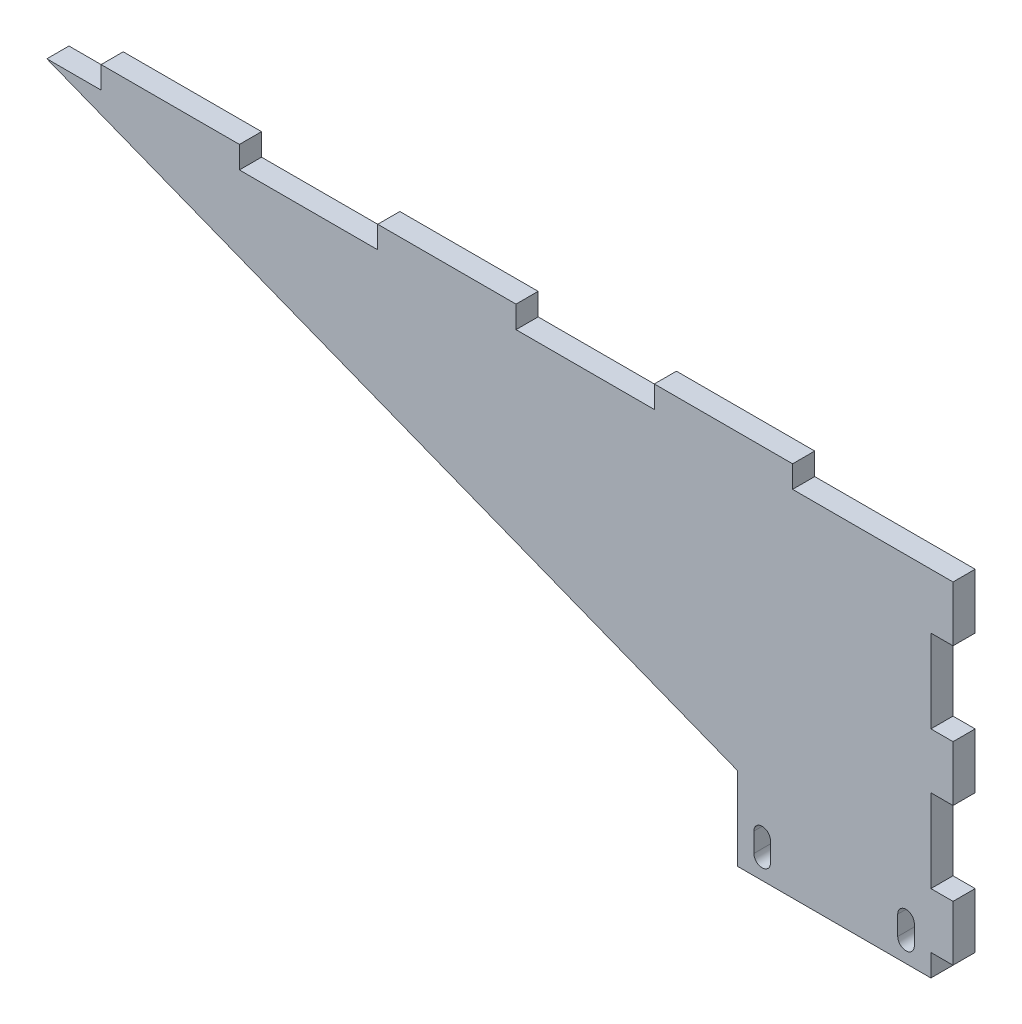
ISO-10303-21;
HEADER;
FILE_DESCRIPTION(('STEP AP214'),'2;1');
FILE_NAME('part.step','',(''),(''),'','','');
FILE_SCHEMA(('AUTOMOTIVE_DESIGN { 1 0 10303 214 1 1 1 1 }'));
ENDSEC;
DATA;
#1=APPLICATION_CONTEXT('core data for automotive mechanical design processes');
#2=APPLICATION_PROTOCOL_DEFINITION('international standard','automotive_design',2000,#1);
#3=PRODUCT_CONTEXT('',#1,'mechanical');
#4=PRODUCT('Part','Part','',(#3));
#5=PRODUCT_RELATED_PRODUCT_CATEGORY('part','',(#4));
#6=PRODUCT_DEFINITION_FORMATION('','',#4);
#7=PRODUCT_DEFINITION_CONTEXT('part definition',#1,'design');
#8=PRODUCT_DEFINITION('design','',#6,#7);
#9=PRODUCT_DEFINITION_SHAPE('','',#8);
#10=(LENGTH_UNIT() NAMED_UNIT(*) SI_UNIT(.MILLI.,.METRE.));
#11=(NAMED_UNIT(*) PLANE_ANGLE_UNIT() SI_UNIT($,.RADIAN.));
#12=(NAMED_UNIT(*) SI_UNIT($,.STERADIAN.) SOLID_ANGLE_UNIT());
#13=UNCERTAINTY_MEASURE_WITH_UNIT(LENGTH_MEASURE(1.E-05),#10,'distance_accuracy_value','');
#14=(GEOMETRIC_REPRESENTATION_CONTEXT(3) GLOBAL_UNCERTAINTY_ASSIGNED_CONTEXT((#13)) GLOBAL_UNIT_ASSIGNED_CONTEXT((#10,
#11,#12)) REPRESENTATION_CONTEXT('',''));
#15=CARTESIAN_POINT('',(0.,0.,0.));
#16=DIRECTION('',(0.,0.,1.));
#17=DIRECTION('',(1.,0.,0.));
#18=AXIS2_PLACEMENT_3D('',#15,#16,#17);
#19=CARTESIAN_POINT('',(0.,4.,2.));
#20=DIRECTION('',(-1.,0.,0.));
#21=DIRECTION('',(0.,0.,1.));
#22=AXIS2_PLACEMENT_3D('',#19,#20,#21);
#23=PLANE('',#22);
#24=DIRECTION('',(0.,0.,1.));
#25=VECTOR('',#24,1.);
#26=CARTESIAN_POINT('',(0.,18.,-2.00000000000052));
#27=LINE('',#26,#25);
#28=CARTESIAN_POINT('',(0.,18.,-2.00000000000052));
#29=VERTEX_POINT('',#28);
#30=CARTESIAN_POINT('',(0.,18.,2.));
#31=VERTEX_POINT('',#30);
#32=EDGE_CURVE('E281',#29,#31,#27,.T.);
#33=ORIENTED_EDGE('',*,*,#32,.F.);
#34=DIRECTION('',(0.,1.,0.));
#35=VECTOR('',#34,1.);
#36=CARTESIAN_POINT('',(0.,4.,-2.));
#37=LINE('',#36,#35);
#38=CARTESIAN_POINT('',(0.,33.,-2.));
#39=VERTEX_POINT('',#38);
#40=EDGE_CURVE('E266',#29,#39,#37,.T.);
#41=ORIENTED_EDGE('',*,*,#40,.T.);
#42=DIRECTION('',(0.,0.,-1.));
#43=VECTOR('',#42,1.);
#44=CARTESIAN_POINT('',(0.,33.,-2.00000000000026));
#45=LINE('',#44,#43);
#46=CARTESIAN_POINT('',(0.,33.,2.));
#47=VERTEX_POINT('',#46);
#48=EDGE_CURVE('E314',#47,#39,#45,.T.);
#49=ORIENTED_EDGE('',*,*,#48,.F.);
#50=DIRECTION('',(0.,1.,0.));
#51=VECTOR('',#50,1.);
#52=CARTESIAN_POINT('',(0.,4.,2.));
#53=LINE('',#52,#51);
#54=EDGE_CURVE('E53',#31,#47,#53,.T.);
#55=ORIENTED_EDGE('',*,*,#54,.F.);
#56=EDGE_LOOP('',(#33,#41,#49,#55));
#57=FACE_BOUND('',#56,.T.);
#58=ADVANCED_FACE('F38',(#57),#23,.F.);
#59=DIRECTION('',(0.,0.,-1.));
#60=VECTOR('',#59,1.);
#61=CARTESIAN_POINT('',(0.,8.00000000000001,-2.00000000000052));
#62=LINE('',#61,#60);
#63=CARTESIAN_POINT('',(0.,8.00000000000001,2.));
#64=VERTEX_POINT('',#63);
#65=CARTESIAN_POINT('',(0.,8.00000000000001,-2.));
#66=VERTEX_POINT('',#65);
#67=EDGE_CURVE('E61',#64,#66,#62,.T.);
#68=ORIENTED_EDGE('',*,*,#67,.F.);
#69=CARTESIAN_POINT('',(0.,4.,2.));
#70=VERTEX_POINT('',#69);
#71=EDGE_CURVE('E495',#70,#64,#53,.T.);
#72=ORIENTED_EDGE('',*,*,#71,.F.);
#73=DIRECTION('',(0.,0.,-1.));
#74=VECTOR('',#73,1.);
#75=CARTESIAN_POINT('',(0.,4.,2.));
#76=LINE('',#75,#74);
#77=CARTESIAN_POINT('',(0.,4.,-2.));
#78=VERTEX_POINT('',#77);
#79=EDGE_CURVE('E46',#70,#78,#76,.T.);
#80=ORIENTED_EDGE('',*,*,#79,.T.);
#81=EDGE_CURVE('E277',#78,#66,#37,.T.);
#82=ORIENTED_EDGE('',*,*,#81,.T.);
#83=EDGE_LOOP('',(#68,#72,#80,#82));
#84=FACE_BOUND('',#83,.T.);
#85=ADVANCED_FACE('F523',(#84),#23,.F.);
#86=DIRECTION('',(0.,0.,1.));
#87=VECTOR('',#86,1.);
#88=CARTESIAN_POINT('',(0.,43.,-2.00000000000026));
#89=LINE('',#88,#87);
#90=CARTESIAN_POINT('',(0.,43.,-2.00000000000026));
#91=VERTEX_POINT('',#90);
#92=CARTESIAN_POINT('',(0.,43.,2.));
#93=VERTEX_POINT('',#92);
#94=EDGE_CURVE('E316',#91,#93,#89,.T.);
#95=ORIENTED_EDGE('',*,*,#94,.F.);
#96=CARTESIAN_POINT('',(0.,58.,-2.));
#97=VERTEX_POINT('',#96);
#98=EDGE_CURVE('E278',#91,#97,#37,.T.);
#99=ORIENTED_EDGE('',*,*,#98,.T.);
#100=DIRECTION('',(0.,0.,-1.));
#101=VECTOR('',#100,1.);
#102=CARTESIAN_POINT('',(0.,58.,-2.));
#103=LINE('',#102,#101);
#104=CARTESIAN_POINT('',(0.,58.,2.));
#105=VERTEX_POINT('',#104);
#106=EDGE_CURVE('E320',#105,#97,#103,.T.);
#107=ORIENTED_EDGE('',*,*,#106,.F.);
#108=EDGE_CURVE('E493',#93,#105,#53,.T.);
#109=ORIENTED_EDGE('',*,*,#108,.F.);
#110=EDGE_LOOP('',(#95,#99,#107,#109));
#111=FACE_BOUND('',#110,.T.);
#112=ADVANCED_FACE('F553',(#111),#23,.F.);
#113=CARTESIAN_POINT('',(0.,72.,2.));
#114=DIRECTION('',(0.,-1.,0.));
#115=DIRECTION('',(1.,0.,0.));
#116=AXIS2_PLACEMENT_3D('',#113,#114,#115);
#117=PLANE('',#116);
#118=DIRECTION('',(-1.,0.,0.));
#119=VECTOR('',#118,1.);
#120=CARTESIAN_POINT('',(0.,72.,2.));
#121=LINE('',#120,#119);
#122=CARTESIAN_POINT('',(-25.,72.,2.));
#123=VERTEX_POINT('',#122);
#124=CARTESIAN_POINT('',(-50.,71.9999999999997,2.));
#125=VERTEX_POINT('',#124);
#126=EDGE_CURVE('E501',#123,#125,#121,.T.);
#127=ORIENTED_EDGE('',*,*,#126,.F.);
#128=DIRECTION('',(0.,0.,1.));
#129=VECTOR('',#128,1.);
#130=CARTESIAN_POINT('',(-25.,72.,-2.));
#131=LINE('',#130,#129);
#132=CARTESIAN_POINT('',(-25.,72.,-2.));
#133=VERTEX_POINT('',#132);
#134=EDGE_CURVE('E352',#133,#123,#131,.T.);
#135=ORIENTED_EDGE('',*,*,#134,.F.);
#136=DIRECTION('',(-1.,0.,0.));
#137=VECTOR('',#136,1.);
#138=CARTESIAN_POINT('',(0.,72.,-2.));
#139=LINE('',#138,#137);
#140=CARTESIAN_POINT('',(-50.,71.9999999999997,-2.));
#141=VERTEX_POINT('',#140);
#142=EDGE_CURVE('E513',#133,#141,#139,.T.);
#143=ORIENTED_EDGE('',*,*,#142,.T.);
#144=DIRECTION('',(0.,0.,1.));
#145=VECTOR('',#144,1.);
#146=CARTESIAN_POINT('',(-50.,71.9999999999997,-2.));
#147=LINE('',#146,#145);
#148=EDGE_CURVE('E369',#141,#125,#147,.T.);
#149=ORIENTED_EDGE('',*,*,#148,.T.);
#150=EDGE_LOOP('',(#127,#135,#143,#149));
#151=FACE_BOUND('',#150,.T.);
#152=ADVANCED_FACE('F559',(#151),#117,.F.);
#153=CARTESIAN_POINT('',(-75.,71.9999999999997,2.));
#154=VERTEX_POINT('',#153);
#155=CARTESIAN_POINT('',(-100.,71.9999999999993,2.));
#156=VERTEX_POINT('',#155);
#157=EDGE_CURVE('E500',#154,#156,#121,.T.);
#158=ORIENTED_EDGE('',*,*,#157,.F.);
#159=DIRECTION('',(0.,0.,1.));
#160=VECTOR('',#159,1.);
#161=CARTESIAN_POINT('',(-75.,71.9999999999997,-2.));
#162=LINE('',#161,#160);
#163=CARTESIAN_POINT('',(-75.,71.9999999999997,-2.));
#164=VERTEX_POINT('',#163);
#165=EDGE_CURVE('E362',#164,#154,#162,.T.);
#166=ORIENTED_EDGE('',*,*,#165,.F.);
#167=CARTESIAN_POINT('',(-100.,71.9999999999993,-2.));
#168=VERTEX_POINT('',#167);
#169=EDGE_CURVE('E512',#164,#168,#139,.T.);
#170=ORIENTED_EDGE('',*,*,#169,.T.);
#171=DIRECTION('',(0.,0.,1.));
#172=VECTOR('',#171,1.);
#173=CARTESIAN_POINT('',(-100.,71.9999999999993,-2.));
#174=LINE('',#173,#172);
#175=EDGE_CURVE('E395',#168,#156,#174,.T.);
#176=ORIENTED_EDGE('',*,*,#175,.T.);
#177=EDGE_LOOP('',(#158,#166,#170,#176));
#178=FACE_BOUND('',#177,.T.);
#179=ADVANCED_FACE('F564',(#178),#117,.F.);
#180=CARTESIAN_POINT('',(-35.,4.,2.));
#181=DIRECTION('',(0.,1.,0.));
#182=DIRECTION('',(0.,0.,1.));
#183=AXIS2_PLACEMENT_3D('',#180,#181,#182);
#184=PLANE('',#183);
#185=DIRECTION('',(1.,0.,0.));
#186=VECTOR('',#185,1.);
#187=CARTESIAN_POINT('',(-35.,4.,-2.));
#188=LINE('',#187,#186);
#189=CARTESIAN_POINT('',(-35.,4.,-2.));
#190=VERTEX_POINT('',#189);
#191=EDGE_CURVE('E460',#190,#78,#188,.T.);
#192=ORIENTED_EDGE('',*,*,#191,.T.);
#193=ORIENTED_EDGE('',*,*,#79,.F.);
#194=DIRECTION('',(1.,0.,0.));
#195=VECTOR('',#194,1.);
#196=CARTESIAN_POINT('',(-35.,4.,2.));
#197=LINE('',#196,#195);
#198=CARTESIAN_POINT('',(-35.,4.,2.));
#199=VERTEX_POINT('',#198);
#200=EDGE_CURVE('E490',#199,#70,#197,.T.);
#201=ORIENTED_EDGE('',*,*,#200,.F.);
#202=DIRECTION('',(0.,0.,-1.));
#203=VECTOR('',#202,1.);
#204=CARTESIAN_POINT('',(-35.,4.,2.));
#205=LINE('',#204,#203);
#206=EDGE_CURVE('E506',#199,#190,#205,.T.);
#207=ORIENTED_EDGE('',*,*,#206,.T.);
#208=EDGE_LOOP('',(#192,#193,#201,#207));
#209=FACE_BOUND('',#208,.T.);
#210=ADVANCED_FACE('F40',(#209),#184,.F.);
#211=CARTESIAN_POINT('',(-125.,71.9999999999993,2.));
#212=VERTEX_POINT('',#211);
#213=CARTESIAN_POINT('',(-150.,71.999999999999,2.));
#214=VERTEX_POINT('',#213);
#215=EDGE_CURVE('E497',#212,#214,#121,.T.);
#216=ORIENTED_EDGE('',*,*,#215,.F.);
#217=DIRECTION('',(0.,0.,1.));
#218=VECTOR('',#217,1.);
#219=CARTESIAN_POINT('',(-125.,71.9999999999993,-2.));
#220=LINE('',#219,#218);
#221=CARTESIAN_POINT('',(-125.,71.9999999999993,-2.));
#222=VERTEX_POINT('',#221);
#223=EDGE_CURVE('E388',#222,#212,#220,.T.);
#224=ORIENTED_EDGE('',*,*,#223,.F.);
#225=CARTESIAN_POINT('',(-150.,71.999999999999,-2.));
#226=VERTEX_POINT('',#225);
#227=EDGE_CURVE('E509',#222,#226,#139,.T.);
#228=ORIENTED_EDGE('',*,*,#227,.T.);
#229=DIRECTION('',(0.,0.,1.));
#230=VECTOR('',#229,1.);
#231=CARTESIAN_POINT('',(-150.,71.999999999999,-2.));
#232=LINE('',#231,#230);
#233=EDGE_CURVE('E346',#226,#214,#232,.T.);
#234=ORIENTED_EDGE('',*,*,#233,.T.);
#235=EDGE_LOOP('',(#216,#224,#228,#234));
#236=FACE_BOUND('',#235,.T.);
#237=ADVANCED_FACE('F566',(#236),#117,.F.);
#238=CARTESIAN_POINT('',(-170.,72.,2.));
#239=DIRECTION('',(0.365439034496619,0.930835276547993,0.));
#240=DIRECTION('',(-0.930835276547993,0.365439034496619,0.));
#241=AXIS2_PLACEMENT_3D('',#238,#239,#240);
#242=PLANE('',#241);
#243=DIRECTION('',(0.930835276547993,-0.365439034496619,0.));
#244=VECTOR('',#243,1.);
#245=CARTESIAN_POINT('',(-170.,72.,2.));
#246=LINE('',#245,#244);
#247=CARTESIAN_POINT('',(-159.811320754714,67.999999999999,2.));
#248=VERTEX_POINT('',#247);
#249=CARTESIAN_POINT('',(-35.,19.,2.));
#250=VERTEX_POINT('',#249);
#251=EDGE_CURVE('E502',#248,#250,#246,.T.);
#252=ORIENTED_EDGE('',*,*,#251,.F.);
#253=DIRECTION('',(0.,0.,-1.));
#254=VECTOR('',#253,1.);
#255=CARTESIAN_POINT('',(-159.811320754714,67.999999999999,2.));
#256=LINE('',#255,#254);
#257=CARTESIAN_POINT('',(-159.811320754714,67.999999999999,-2.));
#258=VERTEX_POINT('',#257);
#259=EDGE_CURVE('E360',#248,#258,#256,.T.);
#260=ORIENTED_EDGE('',*,*,#259,.T.);
#261=DIRECTION('',(0.930835276547993,-0.365439034496619,0.));
#262=VECTOR('',#261,1.);
#263=CARTESIAN_POINT('',(-170.,72.,-2.));
#264=LINE('',#263,#262);
#265=CARTESIAN_POINT('',(-35.,19.,-2.));
#266=VERTEX_POINT('',#265);
#267=EDGE_CURVE('E514',#258,#266,#264,.T.);
#268=ORIENTED_EDGE('',*,*,#267,.T.);
#269=DIRECTION('',(0.,0.,-1.));
#270=VECTOR('',#269,1.);
#271=CARTESIAN_POINT('',(-35.,19.,2.));
#272=LINE('',#271,#270);
#273=EDGE_CURVE('E519',#250,#266,#272,.T.);
#274=ORIENTED_EDGE('',*,*,#273,.F.);
#275=EDGE_LOOP('',(#252,#260,#268,#274));
#276=FACE_BOUND('',#275,.T.);
#277=ADVANCED_FACE('F680',(#276),#242,.F.);
#278=CARTESIAN_POINT('',(-35.,19.,2.));
#279=DIRECTION('',(1.,0.,0.));
#280=DIRECTION('',(0.,0.,-1.));
#281=AXIS2_PLACEMENT_3D('',#278,#279,#280);
#282=PLANE('',#281);
#283=DIRECTION('',(0.,-1.,0.));
#284=VECTOR('',#283,1.);
#285=CARTESIAN_POINT('',(-35.,19.,-2.));
#286=LINE('',#285,#284);
#287=EDGE_CURVE('E494',#266,#190,#286,.T.);
#288=ORIENTED_EDGE('',*,*,#287,.T.);
#289=ORIENTED_EDGE('',*,*,#206,.F.);
#290=DIRECTION('',(0.,-1.,0.));
#291=VECTOR('',#290,1.);
#292=CARTESIAN_POINT('',(-35.,19.,2.));
#293=LINE('',#292,#291);
#294=EDGE_CURVE('E504',#250,#199,#293,.T.);
#295=ORIENTED_EDGE('',*,*,#294,.F.);
#296=ORIENTED_EDGE('',*,*,#273,.T.);
#297=EDGE_LOOP('',(#288,#289,#295,#296));
#298=FACE_BOUND('',#297,.T.);
#299=ADVANCED_FACE('F674',(#298),#282,.F.);
#300=CARTESIAN_POINT('',(0.,0.,2.));
#301=DIRECTION('',(0.,0.,1.));
#302=DIRECTION('',(1.,0.,0.));
#303=AXIS2_PLACEMENT_3D('',#300,#301,#302);
#304=PLANE('',#303);
#305=DIRECTION('',(1.,0.,0.));
#306=VECTOR('',#305,1.);
#307=CARTESIAN_POINT('',(0.,68.,2.));
#308=LINE('',#307,#306);
#309=CARTESIAN_POINT('',(-25.,68.,2.));
#310=VERTEX_POINT('',#309);
#311=CARTESIAN_POINT('',(4.,68.,2.));
#312=VERTEX_POINT('',#311);
#313=EDGE_CURVE('E350',#310,#312,#308,.T.);
#314=ORIENTED_EDGE('',*,*,#313,.F.);
#315=DIRECTION('',(0.,-1.,0.));
#316=VECTOR('',#315,1.);
#317=CARTESIAN_POINT('',(-25.,72.,2.));
#318=LINE('',#317,#316);
#319=EDGE_CURVE('E353',#123,#310,#318,.T.);
#320=ORIENTED_EDGE('',*,*,#319,.F.);
#321=ORIENTED_EDGE('',*,*,#126,.T.);
#322=DIRECTION('',(0.,1.,0.));
#323=VECTOR('',#322,1.);
#324=CARTESIAN_POINT('',(-50.,71.9999999999997,2.));
#325=LINE('',#324,#323);
#326=CARTESIAN_POINT('',(-50.,68.,2.));
#327=VERTEX_POINT('',#326);
#328=EDGE_CURVE('E373',#327,#125,#325,.T.);
#329=ORIENTED_EDGE('',*,*,#328,.F.);
#330=DIRECTION('',(1.,0.,0.));
#331=VECTOR('',#330,1.);
#332=CARTESIAN_POINT('',(-50.,68.,2.));
#333=LINE('',#332,#331);
#334=CARTESIAN_POINT('',(-75.,67.9999999999997,2.));
#335=VERTEX_POINT('',#334);
#336=EDGE_CURVE('E375',#335,#327,#333,.T.);
#337=ORIENTED_EDGE('',*,*,#336,.F.);
#338=DIRECTION('',(0.,-1.,0.));
#339=VECTOR('',#338,1.);
#340=CARTESIAN_POINT('',(-75.,71.9999999999997,2.));
#341=LINE('',#340,#339);
#342=EDGE_CURVE('E356',#154,#335,#341,.T.);
#343=ORIENTED_EDGE('',*,*,#342,.F.);
#344=ORIENTED_EDGE('',*,*,#157,.T.);
#345=DIRECTION('',(0.,1.,0.));
#346=VECTOR('',#345,1.);
#347=CARTESIAN_POINT('',(-100.,71.9999999999993,2.));
#348=LINE('',#347,#346);
#349=CARTESIAN_POINT('',(-100.,67.9999999999993,2.));
#350=VERTEX_POINT('',#349);
#351=EDGE_CURVE('E399',#350,#156,#348,.T.);
#352=ORIENTED_EDGE('',*,*,#351,.F.);
#353=DIRECTION('',(1.,0.,0.));
#354=VECTOR('',#353,1.);
#355=CARTESIAN_POINT('',(-100.,67.9999999999993,2.));
#356=LINE('',#355,#354);
#357=CARTESIAN_POINT('',(-125.,67.9999999999993,2.));
#358=VERTEX_POINT('',#357);
#359=EDGE_CURVE('E401',#358,#350,#356,.T.);
#360=ORIENTED_EDGE('',*,*,#359,.F.);
#361=DIRECTION('',(0.,-1.,0.));
#362=VECTOR('',#361,1.);
#363=CARTESIAN_POINT('',(-125.,71.9999999999993,2.));
#364=LINE('',#363,#362);
#365=EDGE_CURVE('E372',#212,#358,#364,.T.);
#366=ORIENTED_EDGE('',*,*,#365,.F.);
#367=ORIENTED_EDGE('',*,*,#215,.T.);
#368=DIRECTION('',(0.,1.,0.));
#369=VECTOR('',#368,1.);
#370=CARTESIAN_POINT('',(-150.,71.999999999999,2.));
#371=LINE('',#370,#369);
#372=CARTESIAN_POINT('',(-150.,67.999999999999,2.));
#373=VERTEX_POINT('',#372);
#374=EDGE_CURVE('E420',#373,#214,#371,.T.);
#375=ORIENTED_EDGE('',*,*,#374,.F.);
#376=DIRECTION('',(1.,0.,0.));
#377=VECTOR('',#376,1.);
#378=CARTESIAN_POINT('',(-150.,67.999999999999,2.));
#379=LINE('',#378,#377);
#380=EDGE_CURVE('E398',#248,#373,#379,.T.);
#381=ORIENTED_EDGE('',*,*,#380,.F.);
#382=ORIENTED_EDGE('',*,*,#251,.T.);
#383=ORIENTED_EDGE('',*,*,#294,.T.);
#384=ORIENTED_EDGE('',*,*,#200,.T.);
#385=ORIENTED_EDGE('',*,*,#71,.T.);
#386=DIRECTION('',(-1.,0.,0.));
#387=VECTOR('',#386,1.);
#388=CARTESIAN_POINT('',(4.,8.00000000000001,1.99999999999948));
#389=LINE('',#388,#387);
#390=CARTESIAN_POINT('',(4.,8.00000000000001,1.99999999999948));
#391=VERTEX_POINT('',#390);
#392=EDGE_CURVE('E295',#391,#64,#389,.T.);
#393=ORIENTED_EDGE('',*,*,#392,.F.);
#394=DIRECTION('',(0.,-1.,0.));
#395=VECTOR('',#394,1.);
#396=CARTESIAN_POINT('',(4.,18.,1.99999999999948));
#397=LINE('',#396,#395);
#398=CARTESIAN_POINT('',(4.,18.,1.99999999999948));
#399=VERTEX_POINT('',#398);
#400=EDGE_CURVE('E301',#399,#391,#397,.T.);
#401=ORIENTED_EDGE('',*,*,#400,.F.);
#402=DIRECTION('',(-1.,0.,0.));
#403=VECTOR('',#402,1.);
#404=CARTESIAN_POINT('',(4.,18.,1.99999999999948));
#405=LINE('',#404,#403);
#406=EDGE_CURVE('E537',#399,#31,#405,.T.);
#407=ORIENTED_EDGE('',*,*,#406,.T.);
#408=ORIENTED_EDGE('',*,*,#54,.T.);
#409=DIRECTION('',(-1.,0.,0.));
#410=VECTOR('',#409,1.);
#411=CARTESIAN_POINT('',(4.,33.,1.99999999999974));
#412=LINE('',#411,#410);
#413=CARTESIAN_POINT('',(4.,33.,1.99999999999974));
#414=VERTEX_POINT('',#413);
#415=EDGE_CURVE('E306',#414,#47,#412,.T.);
#416=ORIENTED_EDGE('',*,*,#415,.F.);
#417=DIRECTION('',(0.,-1.,0.));
#418=VECTOR('',#417,1.);
#419=CARTESIAN_POINT('',(4.,43.,1.99999999999974));
#420=LINE('',#419,#418);
#421=CARTESIAN_POINT('',(4.,43.,1.99999999999974));
#422=VERTEX_POINT('',#421);
#423=EDGE_CURVE('E324',#422,#414,#420,.T.);
#424=ORIENTED_EDGE('',*,*,#423,.F.);
#425=DIRECTION('',(-1.,0.,0.));
#426=VECTOR('',#425,1.);
#427=CARTESIAN_POINT('',(4.,43.,1.99999999999974));
#428=LINE('',#427,#426);
#429=EDGE_CURVE('E284',#422,#93,#428,.T.);
#430=ORIENTED_EDGE('',*,*,#429,.T.);
#431=ORIENTED_EDGE('',*,*,#108,.T.);
#432=DIRECTION('',(-1.,0.,0.));
#433=VECTOR('',#432,1.);
#434=CARTESIAN_POINT('',(4.,58.,2.));
#435=LINE('',#434,#433);
#436=CARTESIAN_POINT('',(4.,58.,2.));
#437=VERTEX_POINT('',#436);
#438=EDGE_CURVE('E343',#437,#105,#435,.T.);
#439=ORIENTED_EDGE('',*,*,#438,.F.);
#440=DIRECTION('',(0.,-1.,0.));
#441=VECTOR('',#440,1.);
#442=CARTESIAN_POINT('',(4.,68.,2.));
#443=LINE('',#442,#441);
#444=EDGE_CURVE('E334',#312,#437,#443,.T.);
#445=ORIENTED_EDGE('',*,*,#444,.F.);
#446=EDGE_LOOP('',(#314,#320,#321,#329,#337,#343,#344,#352,#360,#366,#367,#375,#381,#382,#383,
#384,#385,#393,#401,#407,#408,#416,#424,#430,#431,#439,#445));
#447=FACE_BOUND('',#446,.T.);
#448=CARTESIAN_POINT('',(-4.5,11.,2.));
#449=DIRECTION('',(0.,0.,1.));
#450=DIRECTION('',(1.,0.,0.));
#451=AXIS2_PLACEMENT_3D('',#448,#449,#450);
#452=CIRCLE('',#451,1.5);
#453=CARTESIAN_POINT('',(-3.,11.,2.));
#454=VERTEX_POINT('',#453);
#455=CARTESIAN_POINT('',(-6.00000000000001,11.,2.));
#456=VERTEX_POINT('',#455);
#457=EDGE_CURVE('E437',#454,#456,#452,.T.);
#458=ORIENTED_EDGE('',*,*,#457,.F.);
#459=DIRECTION('',(0.,1.,0.));
#460=VECTOR('',#459,1.);
#461=CARTESIAN_POINT('',(-3.,11.,2.));
#462=LINE('',#461,#460);
#463=CARTESIAN_POINT('',(-3.,7.5,2.));
#464=VERTEX_POINT('',#463);
#465=EDGE_CURVE('E445',#464,#454,#462,.T.);
#466=ORIENTED_EDGE('',*,*,#465,.F.);
#467=CARTESIAN_POINT('',(-4.5,7.50000000000001,2.));
#468=DIRECTION('',(0.,0.,1.));
#469=DIRECTION('',(1.,0.,0.));
#470=AXIS2_PLACEMENT_3D('',#467,#468,#469);
#471=CIRCLE('',#470,1.5);
#472=CARTESIAN_POINT('',(-6.00000000000001,7.5,2.));
#473=VERTEX_POINT('',#472);
#474=EDGE_CURVE('E442',#473,#464,#471,.T.);
#475=ORIENTED_EDGE('',*,*,#474,.F.);
#476=DIRECTION('',(0.,-1.,0.));
#477=VECTOR('',#476,1.);
#478=CARTESIAN_POINT('',(-6.00000000000001,11.,2.));
#479=LINE('',#478,#477);
#480=EDGE_CURVE('E439',#456,#473,#479,.T.);
#481=ORIENTED_EDGE('',*,*,#480,.F.);
#482=EDGE_LOOP('',(#458,#466,#475,#481));
#483=FACE_BOUND('',#482,.T.);
#484=CARTESIAN_POINT('',(-30.5,11.,2.));
#485=DIRECTION('',(0.,0.,1.));
#486=DIRECTION('',(-1.,0.,0.));
#487=AXIS2_PLACEMENT_3D('',#484,#485,#486);
#488=CIRCLE('',#487,1.5);
#489=CARTESIAN_POINT('',(-29.,11.,2.));
#490=VERTEX_POINT('',#489);
#491=CARTESIAN_POINT('',(-32.,11.,2.));
#492=VERTEX_POINT('',#491);
#493=EDGE_CURVE('E481',#490,#492,#488,.T.);
#494=ORIENTED_EDGE('',*,*,#493,.F.);
#495=DIRECTION('',(0.,1.,0.));
#496=VECTOR('',#495,1.);
#497=CARTESIAN_POINT('',(-29.,11.,2.));
#498=LINE('',#497,#496);
#499=CARTESIAN_POINT('',(-29.,7.5,2.));
#500=VERTEX_POINT('',#499);
#501=EDGE_CURVE('E467',#500,#490,#498,.T.);
#502=ORIENTED_EDGE('',*,*,#501,.F.);
#503=CARTESIAN_POINT('',(-30.5,7.50000000000001,2.));
#504=DIRECTION('',(0.,0.,1.));
#505=DIRECTION('',(-1.,0.,0.));
#506=AXIS2_PLACEMENT_3D('',#503,#504,#505);
#507=CIRCLE('',#506,1.5);
#508=CARTESIAN_POINT('',(-32.,7.5,2.));
#509=VERTEX_POINT('',#508);
#510=EDGE_CURVE('E475',#509,#500,#507,.T.);
#511=ORIENTED_EDGE('',*,*,#510,.F.);
#512=DIRECTION('',(0.,-1.,0.));
#513=VECTOR('',#512,1.);
#514=CARTESIAN_POINT('',(-32.,11.,2.));
#515=LINE('',#514,#513);
#516=EDGE_CURVE('E478',#492,#509,#515,.T.);
#517=ORIENTED_EDGE('',*,*,#516,.F.);
#518=EDGE_LOOP('',(#494,#502,#511,#517));
#519=FACE_BOUND('',#518,.T.);
#520=ADVANCED_FACE('F540',(#447,#483,#519),#304,.T.);
#521=CARTESIAN_POINT('',(0.,0.,-2.));
#522=DIRECTION('',(0.,0.,1.));
#523=DIRECTION('',(1.,0.,0.));
#524=AXIS2_PLACEMENT_3D('',#521,#522,#523);
#525=PLANE('',#524);
#526=DIRECTION('',(0.,-1.,0.));
#527=VECTOR('',#526,1.);
#528=CARTESIAN_POINT('',(-3.,11.,-2.));
#529=LINE('',#528,#527);
#530=CARTESIAN_POINT('',(-3.,11.,-2.));
#531=VERTEX_POINT('',#530);
#532=CARTESIAN_POINT('',(-3.,7.5,-2.));
#533=VERTEX_POINT('',#532);
#534=EDGE_CURVE('E430',#531,#533,#529,.T.);
#535=ORIENTED_EDGE('',*,*,#534,.F.);
#536=CARTESIAN_POINT('',(-4.5,11.,-2.));
#537=DIRECTION('',(0.,0.,1.));
#538=DIRECTION('',(1.,0.,0.));
#539=AXIS2_PLACEMENT_3D('',#536,#537,#538);
#540=CIRCLE('',#539,1.5);
#541=CARTESIAN_POINT('',(-6.00000000000001,11.,-2.));
#542=VERTEX_POINT('',#541);
#543=EDGE_CURVE('E434',#542,#531,#540,.F.);
#544=ORIENTED_EDGE('',*,*,#543,.F.);
#545=DIRECTION('',(0.,1.,0.));
#546=VECTOR('',#545,1.);
#547=CARTESIAN_POINT('',(-6.00000000000001,11.,-2.));
#548=LINE('',#547,#546);
#549=CARTESIAN_POINT('',(-6.00000000000001,7.5,-2.));
#550=VERTEX_POINT('',#549);
#551=EDGE_CURVE('E451',#550,#542,#548,.T.);
#552=ORIENTED_EDGE('',*,*,#551,.F.);
#553=CARTESIAN_POINT('',(-4.5,7.50000000000001,-2.));
#554=DIRECTION('',(0.,0.,1.));
#555=DIRECTION('',(1.,0.,0.));
#556=AXIS2_PLACEMENT_3D('',#553,#554,#555);
#557=CIRCLE('',#556,1.5);
#558=EDGE_CURVE('E428',#533,#550,#557,.F.);
#559=ORIENTED_EDGE('',*,*,#558,.F.);
#560=EDGE_LOOP('',(#535,#544,#552,#559));
#561=FACE_BOUND('',#560,.T.);
#562=DIRECTION('',(0.,-1.,0.));
#563=VECTOR('',#562,1.);
#564=CARTESIAN_POINT('',(-29.,11.,-2.));
#565=LINE('',#564,#563);
#566=CARTESIAN_POINT('',(-29.,11.,-2.));
#567=VERTEX_POINT('',#566);
#568=CARTESIAN_POINT('',(-29.,7.5,-2.));
#569=VERTEX_POINT('',#568);
#570=EDGE_CURVE('E486',#567,#569,#565,.T.);
#571=ORIENTED_EDGE('',*,*,#570,.F.);
#572=CARTESIAN_POINT('',(-30.5,11.,-2.));
#573=DIRECTION('',(0.,0.,1.));
#574=DIRECTION('',(1.,0.,0.));
#575=AXIS2_PLACEMENT_3D('',#572,#573,#574);
#576=CIRCLE('',#575,1.5);
#577=CARTESIAN_POINT('',(-32.,11.,-2.));
#578=VERTEX_POINT('',#577);
#579=EDGE_CURVE('E483',#578,#567,#576,.F.);
#580=ORIENTED_EDGE('',*,*,#579,.F.);
#581=DIRECTION('',(0.,1.,0.));
#582=VECTOR('',#581,1.);
#583=CARTESIAN_POINT('',(-32.,11.,-2.));
#584=LINE('',#583,#582);
#585=CARTESIAN_POINT('',(-32.,7.5,-2.));
#586=VERTEX_POINT('',#585);
#587=EDGE_CURVE('E427',#586,#578,#584,.T.);
#588=ORIENTED_EDGE('',*,*,#587,.F.);
#589=CARTESIAN_POINT('',(-30.5,7.50000000000001,-2.));
#590=DIRECTION('',(0.,0.,1.));
#591=DIRECTION('',(1.,0.,0.));
#592=AXIS2_PLACEMENT_3D('',#589,#590,#591);
#593=CIRCLE('',#592,1.5);
#594=EDGE_CURVE('E431',#569,#586,#593,.F.);
#595=ORIENTED_EDGE('',*,*,#594,.F.);
#596=EDGE_LOOP('',(#571,#580,#588,#595));
#597=FACE_BOUND('',#596,.T.);
#598=DIRECTION('',(0.,-1.,0.));
#599=VECTOR('',#598,1.);
#600=CARTESIAN_POINT('',(-25.,72.,-2.));
#601=LINE('',#600,#599);
#602=CARTESIAN_POINT('',(-25.,68.,-2.));
#603=VERTEX_POINT('',#602);
#604=EDGE_CURVE('E347',#133,#603,#601,.T.);
#605=ORIENTED_EDGE('',*,*,#604,.T.);
#606=DIRECTION('',(1.,0.,0.));
#607=VECTOR('',#606,1.);
#608=CARTESIAN_POINT('',(0.,68.,-2.));
#609=LINE('',#608,#607);
#610=CARTESIAN_POINT('',(4.,68.,-2.));
#611=VERTEX_POINT('',#610);
#612=EDGE_CURVE('E349',#603,#611,#609,.T.);
#613=ORIENTED_EDGE('',*,*,#612,.T.);
#614=DIRECTION('',(0.,1.,0.));
#615=VECTOR('',#614,1.);
#616=CARTESIAN_POINT('',(4.,68.,-2.));
#617=LINE('',#616,#615);
#618=CARTESIAN_POINT('',(4.,58.,-2.));
#619=VERTEX_POINT('',#618);
#620=EDGE_CURVE('E328',#619,#611,#617,.T.);
#621=ORIENTED_EDGE('',*,*,#620,.F.);
#622=DIRECTION('',(-1.,0.,0.));
#623=VECTOR('',#622,1.);
#624=CARTESIAN_POINT('',(4.,58.,-2.));
#625=LINE('',#624,#623);
#626=EDGE_CURVE('E338',#619,#97,#625,.T.);
#627=ORIENTED_EDGE('',*,*,#626,.T.);
#628=ORIENTED_EDGE('',*,*,#98,.F.);
#629=DIRECTION('',(-1.,0.,0.));
#630=VECTOR('',#629,1.);
#631=CARTESIAN_POINT('',(4.,43.,-2.00000000000026));
#632=LINE('',#631,#630);
#633=CARTESIAN_POINT('',(4.,43.,-2.00000000000026));
#634=VERTEX_POINT('',#633);
#635=EDGE_CURVE('E310',#634,#91,#632,.T.);
#636=ORIENTED_EDGE('',*,*,#635,.F.);
#637=DIRECTION('',(0.,1.,0.));
#638=VECTOR('',#637,1.);
#639=CARTESIAN_POINT('',(4.,43.,-2.00000000000026));
#640=LINE('',#639,#638);
#641=CARTESIAN_POINT('',(4.,33.,-2.00000000000026));
#642=VERTEX_POINT('',#641);
#643=EDGE_CURVE('E313',#642,#634,#640,.T.);
#644=ORIENTED_EDGE('',*,*,#643,.F.);
#645=DIRECTION('',(-1.,0.,0.));
#646=VECTOR('',#645,1.);
#647=CARTESIAN_POINT('',(4.,33.,-2.00000000000026));
#648=LINE('',#647,#646);
#649=EDGE_CURVE('E275',#642,#39,#648,.T.);
#650=ORIENTED_EDGE('',*,*,#649,.T.);
#651=ORIENTED_EDGE('',*,*,#40,.F.);
#652=DIRECTION('',(-1.,0.,0.));
#653=VECTOR('',#652,1.);
#654=CARTESIAN_POINT('',(4.,18.,-2.00000000000052));
#655=LINE('',#654,#653);
#656=CARTESIAN_POINT('',(4.,18.,-2.00000000000052));
#657=VERTEX_POINT('',#656);
#658=EDGE_CURVE('E271',#657,#29,#655,.T.);
#659=ORIENTED_EDGE('',*,*,#658,.F.);
#660=DIRECTION('',(0.,1.,0.));
#661=VECTOR('',#660,1.);
#662=CARTESIAN_POINT('',(4.,18.,-2.00000000000052));
#663=LINE('',#662,#661);
#664=CARTESIAN_POINT('',(4.,8.00000000000001,-2.00000000000052));
#665=VERTEX_POINT('',#664);
#666=EDGE_CURVE('E289',#665,#657,#663,.T.);
#667=ORIENTED_EDGE('',*,*,#666,.F.);
#668=DIRECTION('',(-1.,0.,0.));
#669=VECTOR('',#668,1.);
#670=CARTESIAN_POINT('',(4.,8.00000000000001,-2.00000000000052));
#671=LINE('',#670,#669);
#672=EDGE_CURVE('E290',#665,#66,#671,.T.);
#673=ORIENTED_EDGE('',*,*,#672,.T.);
#674=ORIENTED_EDGE('',*,*,#81,.F.);
#675=ORIENTED_EDGE('',*,*,#191,.F.);
#676=ORIENTED_EDGE('',*,*,#287,.F.);
#677=ORIENTED_EDGE('',*,*,#267,.F.);
#678=DIRECTION('',(1.,0.,0.));
#679=VECTOR('',#678,1.);
#680=CARTESIAN_POINT('',(0.,67.999999999999,-2.));
#681=LINE('',#680,#679);
#682=CARTESIAN_POINT('',(-150.,67.999999999999,-2.));
#683=VERTEX_POINT('',#682);
#684=EDGE_CURVE('E11',#258,#683,#681,.T.);
#685=ORIENTED_EDGE('',*,*,#684,.T.);
#686=DIRECTION('',(0.,1.,0.));
#687=VECTOR('',#686,1.);
#688=CARTESIAN_POINT('',(-150.,71.999999999999,-2.));
#689=LINE('',#688,#687);
#690=EDGE_CURVE('E417',#683,#226,#689,.T.);
#691=ORIENTED_EDGE('',*,*,#690,.T.);
#692=ORIENTED_EDGE('',*,*,#227,.F.);
#693=DIRECTION('',(0.,-1.,0.));
#694=VECTOR('',#693,1.);
#695=CARTESIAN_POINT('',(-125.,71.9999999999993,-2.));
#696=LINE('',#695,#694);
#697=CARTESIAN_POINT('',(-125.,67.9999999999993,-2.));
#698=VERTEX_POINT('',#697);
#699=EDGE_CURVE('E402',#222,#698,#696,.T.);
#700=ORIENTED_EDGE('',*,*,#699,.T.);
#701=DIRECTION('',(1.,0.,0.));
#702=VECTOR('',#701,1.);
#703=CARTESIAN_POINT('',(-100.,67.9999999999993,-2.));
#704=LINE('',#703,#702);
#705=CARTESIAN_POINT('',(-100.,67.9999999999993,-2.));
#706=VERTEX_POINT('',#705);
#707=EDGE_CURVE('E409',#698,#706,#704,.T.);
#708=ORIENTED_EDGE('',*,*,#707,.T.);
#709=DIRECTION('',(0.,1.,0.));
#710=VECTOR('',#709,1.);
#711=CARTESIAN_POINT('',(-100.,71.9999999999993,-2.));
#712=LINE('',#711,#710);
#713=EDGE_CURVE('E390',#706,#168,#712,.T.);
#714=ORIENTED_EDGE('',*,*,#713,.T.);
#715=ORIENTED_EDGE('',*,*,#169,.F.);
#716=DIRECTION('',(0.,-1.,0.));
#717=VECTOR('',#716,1.);
#718=CARTESIAN_POINT('',(-75.,71.9999999999997,-2.));
#719=LINE('',#718,#717);
#720=CARTESIAN_POINT('',(-75.,67.9999999999997,-2.));
#721=VERTEX_POINT('',#720);
#722=EDGE_CURVE('E376',#164,#721,#719,.T.);
#723=ORIENTED_EDGE('',*,*,#722,.T.);
#724=DIRECTION('',(1.,0.,0.));
#725=VECTOR('',#724,1.);
#726=CARTESIAN_POINT('',(-50.,68.,-2.));
#727=LINE('',#726,#725);
#728=CARTESIAN_POINT('',(-50.,68.,-2.));
#729=VERTEX_POINT('',#728);
#730=EDGE_CURVE('E383',#721,#729,#727,.T.);
#731=ORIENTED_EDGE('',*,*,#730,.T.);
#732=DIRECTION('',(0.,1.,0.));
#733=VECTOR('',#732,1.);
#734=CARTESIAN_POINT('',(-50.,71.9999999999997,-2.));
#735=LINE('',#734,#733);
#736=EDGE_CURVE('E364',#729,#141,#735,.T.);
#737=ORIENTED_EDGE('',*,*,#736,.T.);
#738=ORIENTED_EDGE('',*,*,#142,.F.);
#739=EDGE_LOOP('',(#605,#613,#621,#627,#628,#636,#644,#650,#651,#659,#667,#673,#674,#675,#676,
#677,#685,#691,#692,#700,#708,#714,#715,#723,#731,#737,#738));
#740=FACE_BOUND('',#739,.T.);
#741=ADVANCED_FACE('F268',(#561,#597,#740),#525,.F.);
#742=CARTESIAN_POINT('',(-30.5,11.,-2.001));
#743=DIRECTION('',(0.,0.,1.));
#744=DIRECTION('',(1.,0.,0.));
#745=AXIS2_PLACEMENT_3D('',#742,#743,#744);
#746=CYLINDRICAL_SURFACE('',#745,1.5);
#747=ORIENTED_EDGE('',*,*,#579,.T.);
#748=DIRECTION('',(0.,0.,1.));
#749=VECTOR('',#748,1.);
#750=CARTESIAN_POINT('',(-29.,11.,-2.001));
#751=LINE('',#750,#749);
#752=EDGE_CURVE('E463',#567,#490,#751,.T.);
#753=ORIENTED_EDGE('',*,*,#752,.T.);
#754=ORIENTED_EDGE('',*,*,#493,.T.);
#755=DIRECTION('',(0.,0.,1.));
#756=VECTOR('',#755,1.);
#757=CARTESIAN_POINT('',(-32.,11.,-2.001));
#758=LINE('',#757,#756);
#759=EDGE_CURVE('E464',#578,#492,#758,.T.);
#760=ORIENTED_EDGE('',*,*,#759,.F.);
#761=EDGE_LOOP('',(#747,#753,#754,#760));
#762=FACE_BOUND('',#761,.T.);
#763=ADVANCED_FACE('F657',(#762),#746,.F.);
#764=CARTESIAN_POINT('',(-29.,11.,-2.001));
#765=DIRECTION('',(1.,0.,0.));
#766=DIRECTION('',(0.,0.,-1.));
#767=AXIS2_PLACEMENT_3D('',#764,#765,#766);
#768=PLANE('',#767);
#769=ORIENTED_EDGE('',*,*,#570,.T.);
#770=DIRECTION('',(0.,0.,1.));
#771=VECTOR('',#770,1.);
#772=CARTESIAN_POINT('',(-29.,7.5,-2.001));
#773=LINE('',#772,#771);
#774=EDGE_CURVE('E470',#569,#500,#773,.T.);
#775=ORIENTED_EDGE('',*,*,#774,.T.);
#776=ORIENTED_EDGE('',*,*,#501,.T.);
#777=ORIENTED_EDGE('',*,*,#752,.F.);
#778=EDGE_LOOP('',(#769,#775,#776,#777));
#779=FACE_BOUND('',#778,.T.);
#780=ADVANCED_FACE('F660',(#779),#768,.F.);
#781=CARTESIAN_POINT('',(-30.5,7.50000000000001,-2.001));
#782=DIRECTION('',(0.,0.,1.));
#783=DIRECTION('',(1.,0.,0.));
#784=AXIS2_PLACEMENT_3D('',#781,#782,#783);
#785=CYLINDRICAL_SURFACE('',#784,1.5);
#786=ORIENTED_EDGE('',*,*,#594,.T.);
#787=DIRECTION('',(0.,0.,1.));
#788=VECTOR('',#787,1.);
#789=CARTESIAN_POINT('',(-32.,7.5,-2.001));
#790=LINE('',#789,#788);
#791=EDGE_CURVE('E468',#586,#509,#790,.T.);
#792=ORIENTED_EDGE('',*,*,#791,.T.);
#793=ORIENTED_EDGE('',*,*,#510,.T.);
#794=ORIENTED_EDGE('',*,*,#774,.F.);
#795=EDGE_LOOP('',(#786,#792,#793,#794));
#796=FACE_BOUND('',#795,.T.);
#797=ADVANCED_FACE('F664',(#796),#785,.F.);
#798=CARTESIAN_POINT('',(-32.,11.,-2.001));
#799=DIRECTION('',(-1.,0.,0.));
#800=DIRECTION('',(0.,0.,1.));
#801=AXIS2_PLACEMENT_3D('',#798,#799,#800);
#802=PLANE('',#801);
#803=ORIENTED_EDGE('',*,*,#587,.T.);
#804=ORIENTED_EDGE('',*,*,#759,.T.);
#805=ORIENTED_EDGE('',*,*,#516,.T.);
#806=ORIENTED_EDGE('',*,*,#791,.F.);
#807=EDGE_LOOP('',(#803,#804,#805,#806));
#808=FACE_BOUND('',#807,.T.);
#809=ADVANCED_FACE('F655',(#808),#802,.F.);
#810=CARTESIAN_POINT('',(-4.5,11.,-2.001));
#811=DIRECTION('',(0.,0.,1.));
#812=DIRECTION('',(1.,0.,0.));
#813=AXIS2_PLACEMENT_3D('',#810,#811,#812);
#814=CYLINDRICAL_SURFACE('',#813,1.5);
#815=ORIENTED_EDGE('',*,*,#543,.T.);
#816=DIRECTION('',(0.,0.,1.));
#817=VECTOR('',#816,1.);
#818=CARTESIAN_POINT('',(-3.,11.,-2.001));
#819=LINE('',#818,#817);
#820=EDGE_CURVE('E449',#531,#454,#819,.T.);
#821=ORIENTED_EDGE('',*,*,#820,.T.);
#822=ORIENTED_EDGE('',*,*,#457,.T.);
#823=DIRECTION('',(0.,0.,1.));
#824=VECTOR('',#823,1.);
#825=CARTESIAN_POINT('',(-6.00000000000001,11.,-2.001));
#826=LINE('',#825,#824);
#827=EDGE_CURVE('E448',#542,#456,#826,.T.);
#828=ORIENTED_EDGE('',*,*,#827,.F.);
#829=EDGE_LOOP('',(#815,#821,#822,#828));
#830=FACE_BOUND('',#829,.T.);
#831=ADVANCED_FACE('F645',(#830),#814,.F.);
#832=CARTESIAN_POINT('',(-3.,11.,-2.001));
#833=DIRECTION('',(1.,0.,0.));
#834=DIRECTION('',(0.,1.,0.));
#835=AXIS2_PLACEMENT_3D('',#832,#833,#834);
#836=PLANE('',#835);
#837=ORIENTED_EDGE('',*,*,#534,.T.);
#838=DIRECTION('',(0.,0.,1.));
#839=VECTOR('',#838,1.);
#840=CARTESIAN_POINT('',(-3.,7.5,-2.001));
#841=LINE('',#840,#839);
#842=EDGE_CURVE('E452',#533,#464,#841,.T.);
#843=ORIENTED_EDGE('',*,*,#842,.T.);
#844=ORIENTED_EDGE('',*,*,#465,.T.);
#845=ORIENTED_EDGE('',*,*,#820,.F.);
#846=EDGE_LOOP('',(#837,#843,#844,#845));
#847=FACE_BOUND('',#846,.T.);
#848=ADVANCED_FACE('F641',(#847),#836,.F.);
#849=CARTESIAN_POINT('',(-4.5,7.50000000000001,-2.001));
#850=DIRECTION('',(0.,0.,1.));
#851=DIRECTION('',(1.,0.,0.));
#852=AXIS2_PLACEMENT_3D('',#849,#850,#851);
#853=CYLINDRICAL_SURFACE('',#852,1.5);
#854=ORIENTED_EDGE('',*,*,#558,.T.);
#855=DIRECTION('',(0.,0.,1.));
#856=VECTOR('',#855,1.);
#857=CARTESIAN_POINT('',(-6.00000000000001,7.5,-2.001));
#858=LINE('',#857,#856);
#859=EDGE_CURVE('E454',#550,#473,#858,.T.);
#860=ORIENTED_EDGE('',*,*,#859,.T.);
#861=ORIENTED_EDGE('',*,*,#474,.T.);
#862=ORIENTED_EDGE('',*,*,#842,.F.);
#863=EDGE_LOOP('',(#854,#860,#861,#862));
#864=FACE_BOUND('',#863,.T.);
#865=ADVANCED_FACE('F644',(#864),#853,.F.);
#866=CARTESIAN_POINT('',(-6.00000000000001,11.,-2.001));
#867=DIRECTION('',(-1.,0.,0.));
#868=DIRECTION('',(0.,0.,1.));
#869=AXIS2_PLACEMENT_3D('',#866,#867,#868);
#870=PLANE('',#869);
#871=ORIENTED_EDGE('',*,*,#551,.T.);
#872=ORIENTED_EDGE('',*,*,#827,.T.);
#873=ORIENTED_EDGE('',*,*,#480,.T.);
#874=ORIENTED_EDGE('',*,*,#859,.F.);
#875=EDGE_LOOP('',(#871,#872,#873,#874));
#876=FACE_BOUND('',#875,.T.);
#877=ADVANCED_FACE('F636',(#876),#870,.F.);
#878=CARTESIAN_POINT('',(-150.,67.999999999999,-2.));
#879=DIRECTION('',(0.,-1.,0.));
#880=DIRECTION('',(0.,0.,-1.));
#881=AXIS2_PLACEMENT_3D('',#878,#879,#880);
#882=PLANE('',#881);
#883=ORIENTED_EDGE('',*,*,#380,.T.);
#884=DIRECTION('',(0.,0.,1.));
#885=VECTOR('',#884,1.);
#886=CARTESIAN_POINT('',(-150.,67.999999999999,-2.));
#887=LINE('',#886,#885);
#888=EDGE_CURVE('E414',#683,#373,#887,.T.);
#889=ORIENTED_EDGE('',*,*,#888,.F.);
#890=ORIENTED_EDGE('',*,*,#684,.F.);
#891=ORIENTED_EDGE('',*,*,#259,.F.);
#892=EDGE_LOOP('',(#883,#889,#890,#891));
#893=FACE_BOUND('',#892,.T.);
#894=ADVANCED_FACE('F633',(#893),#882,.F.);
#895=CARTESIAN_POINT('',(-150.,71.999999999999,-2.));
#896=DIRECTION('',(1.,0.,0.));
#897=DIRECTION('',(0.,0.,-1.));
#898=AXIS2_PLACEMENT_3D('',#895,#896,#897);
#899=PLANE('',#898);
#900=ORIENTED_EDGE('',*,*,#374,.T.);
#901=ORIENTED_EDGE('',*,*,#233,.F.);
#902=ORIENTED_EDGE('',*,*,#690,.F.);
#903=ORIENTED_EDGE('',*,*,#888,.T.);
#904=EDGE_LOOP('',(#900,#901,#902,#903));
#905=FACE_BOUND('',#904,.T.);
#906=ADVANCED_FACE('F631',(#905),#899,.F.);
#907=CARTESIAN_POINT('',(-100.,71.9999999999993,-2.));
#908=DIRECTION('',(1.,0.,0.));
#909=DIRECTION('',(0.,0.,-1.));
#910=AXIS2_PLACEMENT_3D('',#907,#908,#909);
#911=PLANE('',#910);
#912=ORIENTED_EDGE('',*,*,#351,.T.);
#913=ORIENTED_EDGE('',*,*,#175,.F.);
#914=ORIENTED_EDGE('',*,*,#713,.F.);
#915=DIRECTION('',(0.,0.,1.));
#916=VECTOR('',#915,1.);
#917=CARTESIAN_POINT('',(-100.,67.9999999999993,-2.));
#918=LINE('',#917,#916);
#919=EDGE_CURVE('E393',#706,#350,#918,.T.);
#920=ORIENTED_EDGE('',*,*,#919,.T.);
#921=EDGE_LOOP('',(#912,#913,#914,#920));
#922=FACE_BOUND('',#921,.T.);
#923=ADVANCED_FACE('F627',(#922),#911,.F.);
#924=CARTESIAN_POINT('',(-100.,67.9999999999993,-2.));
#925=DIRECTION('',(0.,-1.,0.));
#926=DIRECTION('',(0.,0.,-1.));
#927=AXIS2_PLACEMENT_3D('',#924,#925,#926);
#928=PLANE('',#927);
#929=ORIENTED_EDGE('',*,*,#359,.T.);
#930=ORIENTED_EDGE('',*,*,#919,.F.);
#931=ORIENTED_EDGE('',*,*,#707,.F.);
#932=DIRECTION('',(0.,0.,1.));
#933=VECTOR('',#932,1.);
#934=CARTESIAN_POINT('',(-125.,67.9999999999993,-2.));
#935=LINE('',#934,#933);
#936=EDGE_CURVE('E391',#698,#358,#935,.T.);
#937=ORIENTED_EDGE('',*,*,#936,.T.);
#938=EDGE_LOOP('',(#929,#930,#931,#937));
#939=FACE_BOUND('',#938,.T.);
#940=ADVANCED_FACE('F623',(#939),#928,.F.);
#941=CARTESIAN_POINT('',(-125.,71.9999999999993,-2.));
#942=DIRECTION('',(-1.,0.,0.));
#943=DIRECTION('',(0.,0.,1.));
#944=AXIS2_PLACEMENT_3D('',#941,#942,#943);
#945=PLANE('',#944);
#946=ORIENTED_EDGE('',*,*,#365,.T.);
#947=ORIENTED_EDGE('',*,*,#936,.F.);
#948=ORIENTED_EDGE('',*,*,#699,.F.);
#949=ORIENTED_EDGE('',*,*,#223,.T.);
#950=EDGE_LOOP('',(#946,#947,#948,#949));
#951=FACE_BOUND('',#950,.T.);
#952=ADVANCED_FACE('F619',(#951),#945,.F.);
#953=CARTESIAN_POINT('',(-50.,71.9999999999997,-2.));
#954=DIRECTION('',(1.,0.,0.));
#955=DIRECTION('',(0.,0.,-1.));
#956=AXIS2_PLACEMENT_3D('',#953,#954,#955);
#957=PLANE('',#956);
#958=ORIENTED_EDGE('',*,*,#328,.T.);
#959=ORIENTED_EDGE('',*,*,#148,.F.);
#960=ORIENTED_EDGE('',*,*,#736,.F.);
#961=DIRECTION('',(0.,0.,1.));
#962=VECTOR('',#961,1.);
#963=CARTESIAN_POINT('',(-50.,68.,-2.));
#964=LINE('',#963,#962);
#965=EDGE_CURVE('E367',#729,#327,#964,.T.);
#966=ORIENTED_EDGE('',*,*,#965,.T.);
#967=EDGE_LOOP('',(#958,#959,#960,#966));
#968=FACE_BOUND('',#967,.T.);
#969=ADVANCED_FACE('F615',(#968),#957,.F.);
#970=CARTESIAN_POINT('',(-50.,68.,-2.));
#971=DIRECTION('',(0.,-1.,0.));
#972=DIRECTION('',(1.,0.,0.));
#973=AXIS2_PLACEMENT_3D('',#970,#971,#972);
#974=PLANE('',#973);
#975=ORIENTED_EDGE('',*,*,#336,.T.);
#976=ORIENTED_EDGE('',*,*,#965,.F.);
#977=ORIENTED_EDGE('',*,*,#730,.F.);
#978=DIRECTION('',(0.,0.,1.));
#979=VECTOR('',#978,1.);
#980=CARTESIAN_POINT('',(-75.,67.9999999999997,-2.));
#981=LINE('',#980,#979);
#982=EDGE_CURVE('E365',#721,#335,#981,.T.);
#983=ORIENTED_EDGE('',*,*,#982,.T.);
#984=EDGE_LOOP('',(#975,#976,#977,#983));
#985=FACE_BOUND('',#984,.T.);
#986=ADVANCED_FACE('F611',(#985),#974,.F.);
#987=CARTESIAN_POINT('',(-75.,71.9999999999997,-2.));
#988=DIRECTION('',(-1.,0.,0.));
#989=DIRECTION('',(0.,0.,1.));
#990=AXIS2_PLACEMENT_3D('',#987,#988,#989);
#991=PLANE('',#990);
#992=ORIENTED_EDGE('',*,*,#342,.T.);
#993=ORIENTED_EDGE('',*,*,#982,.F.);
#994=ORIENTED_EDGE('',*,*,#722,.F.);
#995=ORIENTED_EDGE('',*,*,#165,.T.);
#996=EDGE_LOOP('',(#992,#993,#994,#995));
#997=FACE_BOUND('',#996,.T.);
#998=ADVANCED_FACE('F604',(#997),#991,.F.);
#999=CARTESIAN_POINT('',(0.,68.,-2.));
#1000=DIRECTION('',(0.,-1.,0.));
#1001=DIRECTION('',(0.,0.,-1.));
#1002=AXIS2_PLACEMENT_3D('',#999,#1000,#1001);
#1003=PLANE('',#1002);
#1004=ORIENTED_EDGE('',*,*,#313,.T.);
#1005=DIRECTION('',(0.,0.,1.));
#1006=VECTOR('',#1005,1.);
#1007=CARTESIAN_POINT('',(4.,68.,-2.));
#1008=LINE('',#1007,#1006);
#1009=EDGE_CURVE('E331',#611,#312,#1008,.T.);
#1010=ORIENTED_EDGE('',*,*,#1009,.F.);
#1011=ORIENTED_EDGE('',*,*,#612,.F.);
#1012=DIRECTION('',(0.,0.,1.));
#1013=VECTOR('',#1012,1.);
#1014=CARTESIAN_POINT('',(-25.,68.,-2.));
#1015=LINE('',#1014,#1013);
#1016=EDGE_CURVE('E358',#603,#310,#1015,.T.);
#1017=ORIENTED_EDGE('',*,*,#1016,.T.);
#1018=EDGE_LOOP('',(#1004,#1010,#1011,#1017));
#1019=FACE_BOUND('',#1018,.T.);
#1020=ADVANCED_FACE('F601',(#1019),#1003,.F.);
#1021=CARTESIAN_POINT('',(-25.,72.,-2.));
#1022=DIRECTION('',(-1.,0.,0.));
#1023=DIRECTION('',(0.,0.,1.));
#1024=AXIS2_PLACEMENT_3D('',#1021,#1022,#1023);
#1025=PLANE('',#1024);
#1026=ORIENTED_EDGE('',*,*,#319,.T.);
#1027=ORIENTED_EDGE('',*,*,#1016,.F.);
#1028=ORIENTED_EDGE('',*,*,#604,.F.);
#1029=ORIENTED_EDGE('',*,*,#134,.T.);
#1030=EDGE_LOOP('',(#1026,#1027,#1028,#1029));
#1031=FACE_BOUND('',#1030,.T.);
#1032=ADVANCED_FACE('F600',(#1031),#1025,.F.);
#1033=CARTESIAN_POINT('',(4.,58.,-2.));
#1034=DIRECTION('',(0.,1.,0.));
#1035=DIRECTION('',(0.,0.,1.));
#1036=AXIS2_PLACEMENT_3D('',#1033,#1034,#1035);
#1037=PLANE('',#1036);
#1038=ORIENTED_EDGE('',*,*,#106,.T.);
#1039=ORIENTED_EDGE('',*,*,#626,.F.);
#1040=DIRECTION('',(0.,0.,-1.));
#1041=VECTOR('',#1040,1.);
#1042=CARTESIAN_POINT('',(4.,58.,-2.));
#1043=LINE('',#1042,#1041);
#1044=EDGE_CURVE('E336',#437,#619,#1043,.T.);
#1045=ORIENTED_EDGE('',*,*,#1044,.F.);
#1046=ORIENTED_EDGE('',*,*,#438,.T.);
#1047=EDGE_LOOP('',(#1038,#1039,#1045,#1046));
#1048=FACE_BOUND('',#1047,.T.);
#1049=ADVANCED_FACE('F578',(#1048),#1037,.F.);
#1050=CARTESIAN_POINT('',(4.,0.,0.));
#1051=DIRECTION('',(-1.,0.,0.));
#1052=DIRECTION('',(0.,0.,1.));
#1053=AXIS2_PLACEMENT_3D('',#1050,#1051,#1052);
#1054=PLANE('',#1053);
#1055=ORIENTED_EDGE('',*,*,#620,.T.);
#1056=ORIENTED_EDGE('',*,*,#1009,.T.);
#1057=ORIENTED_EDGE('',*,*,#444,.T.);
#1058=ORIENTED_EDGE('',*,*,#1044,.T.);
#1059=EDGE_LOOP('',(#1055,#1056,#1057,#1058));
#1060=FACE_BOUND('',#1059,.T.);
#1061=ADVANCED_FACE('F593',(#1060),#1054,.F.);
#1062=CARTESIAN_POINT('',(4.,43.,-2.00000000000026));
#1063=DIRECTION('',(0.,-1.,0.));
#1064=DIRECTION('',(0.,0.,-1.));
#1065=AXIS2_PLACEMENT_3D('',#1062,#1063,#1064);
#1066=PLANE('',#1065);
#1067=ORIENTED_EDGE('',*,*,#94,.T.);
#1068=ORIENTED_EDGE('',*,*,#429,.F.);
#1069=DIRECTION('',(0.,0.,1.));
#1070=VECTOR('',#1069,1.);
#1071=CARTESIAN_POINT('',(4.,43.,-2.00000000000026));
#1072=LINE('',#1071,#1070);
#1073=EDGE_CURVE('E317',#634,#422,#1072,.T.);
#1074=ORIENTED_EDGE('',*,*,#1073,.F.);
#1075=ORIENTED_EDGE('',*,*,#635,.T.);
#1076=EDGE_LOOP('',(#1067,#1068,#1074,#1075));
#1077=FACE_BOUND('',#1076,.T.);
#1078=ADVANCED_FACE('F573',(#1077),#1066,.F.);
#1079=CARTESIAN_POINT('',(4.,33.,-2.00000000000026));
#1080=DIRECTION('',(0.,1.,0.));
#1081=DIRECTION('',(0.,0.,1.));
#1082=AXIS2_PLACEMENT_3D('',#1079,#1080,#1081);
#1083=PLANE('',#1082);
#1084=ORIENTED_EDGE('',*,*,#48,.T.);
#1085=ORIENTED_EDGE('',*,*,#649,.F.);
#1086=DIRECTION('',(0.,0.,-1.));
#1087=VECTOR('',#1086,1.);
#1088=CARTESIAN_POINT('',(4.,33.,-2.00000000000026));
#1089=LINE('',#1088,#1087);
#1090=EDGE_CURVE('E322',#414,#642,#1089,.T.);
#1091=ORIENTED_EDGE('',*,*,#1090,.F.);
#1092=ORIENTED_EDGE('',*,*,#415,.T.);
#1093=EDGE_LOOP('',(#1084,#1085,#1091,#1092));
#1094=FACE_BOUND('',#1093,.T.);
#1095=ADVANCED_FACE('F585',(#1094),#1083,.F.);
#1096=CARTESIAN_POINT('',(4.,0.,0.));
#1097=DIRECTION('',(1.,0.,0.));
#1098=DIRECTION('',(0.,0.,-1.));
#1099=AXIS2_PLACEMENT_3D('',#1096,#1097,#1098);
#1100=PLANE('',#1099);
#1101=ORIENTED_EDGE('',*,*,#1073,.T.);
#1102=ORIENTED_EDGE('',*,*,#423,.T.);
#1103=ORIENTED_EDGE('',*,*,#1090,.T.);
#1104=ORIENTED_EDGE('',*,*,#643,.T.);
#1105=EDGE_LOOP('',(#1101,#1102,#1103,#1104));
#1106=FACE_BOUND('',#1105,.T.);
#1107=ADVANCED_FACE('F583',(#1106),#1100,.T.);
#1108=CARTESIAN_POINT('',(4.,18.,-2.00000000000052));
#1109=DIRECTION('',(0.,-1.,0.));
#1110=DIRECTION('',(0.,0.,-1.));
#1111=AXIS2_PLACEMENT_3D('',#1108,#1109,#1110);
#1112=PLANE('',#1111);
#1113=ORIENTED_EDGE('',*,*,#32,.T.);
#1114=ORIENTED_EDGE('',*,*,#406,.F.);
#1115=DIRECTION('',(0.,0.,1.));
#1116=VECTOR('',#1115,1.);
#1117=CARTESIAN_POINT('',(4.,18.,-2.00000000000052));
#1118=LINE('',#1117,#1116);
#1119=EDGE_CURVE('E288',#657,#399,#1118,.T.);
#1120=ORIENTED_EDGE('',*,*,#1119,.F.);
#1121=ORIENTED_EDGE('',*,*,#658,.T.);
#1122=EDGE_LOOP('',(#1113,#1114,#1120,#1121));
#1123=FACE_BOUND('',#1122,.T.);
#1124=ADVANCED_FACE('F286',(#1123),#1112,.F.);
#1125=CARTESIAN_POINT('',(4.,8.00000000000001,-2.00000000000052));
#1126=DIRECTION('',(0.,1.,0.));
#1127=DIRECTION('',(0.,0.,1.));
#1128=AXIS2_PLACEMENT_3D('',#1125,#1126,#1127);
#1129=PLANE('',#1128);
#1130=ORIENTED_EDGE('',*,*,#67,.T.);
#1131=ORIENTED_EDGE('',*,*,#672,.F.);
#1132=DIRECTION('',(0.,0.,-1.));
#1133=VECTOR('',#1132,1.);
#1134=CARTESIAN_POINT('',(4.,8.00000000000001,-2.00000000000052));
#1135=LINE('',#1134,#1133);
#1136=EDGE_CURVE('E292',#391,#665,#1135,.T.);
#1137=ORIENTED_EDGE('',*,*,#1136,.F.);
#1138=ORIENTED_EDGE('',*,*,#392,.T.);
#1139=EDGE_LOOP('',(#1130,#1131,#1137,#1138));
#1140=FACE_BOUND('',#1139,.T.);
#1141=ADVANCED_FACE('F533',(#1140),#1129,.F.);
#1142=CARTESIAN_POINT('',(4.,0.,0.));
#1143=DIRECTION('',(1.,0.,0.));
#1144=DIRECTION('',(0.,0.,-1.));
#1145=AXIS2_PLACEMENT_3D('',#1142,#1143,#1144);
#1146=PLANE('',#1145);
#1147=ORIENTED_EDGE('',*,*,#1119,.T.);
#1148=ORIENTED_EDGE('',*,*,#400,.T.);
#1149=ORIENTED_EDGE('',*,*,#1136,.T.);
#1150=ORIENTED_EDGE('',*,*,#666,.T.);
#1151=EDGE_LOOP('',(#1147,#1148,#1149,#1150));
#1152=FACE_BOUND('',#1151,.T.);
#1153=ADVANCED_FACE('F544',(#1152),#1146,.T.);
#1154=CLOSED_SHELL('',(#58,#85,#112,#152,#179,#210,#237,#277,#299,#520,#741,#763,#780,#797,#809,
#831,#848,#865,#877,#894,#906,#923,#940,#952,#969,#986,#998,#1020,#1032,#1049,#1061,#1078,#1095,
#1107,#1124,#1141,#1153));
#1155=MANIFOLD_SOLID_BREP('B2',#1154);
#1156=ADVANCED_BREP_SHAPE_REPRESENTATION('',(#18,#1155),#14);
#1157=SHAPE_DEFINITION_REPRESENTATION(#9,#1156);
ENDSEC;
END-ISO-10303-21;
